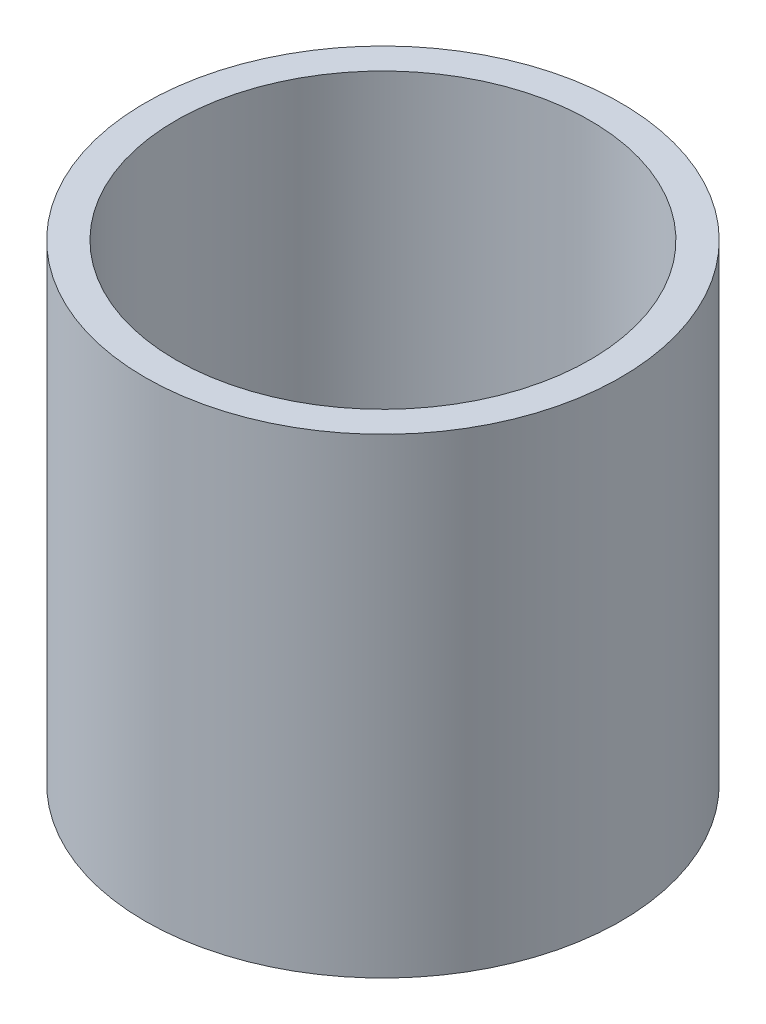
ISO-10303-21;
HEADER;
FILE_DESCRIPTION(('STEP AP214'),'2;1');
FILE_NAME('part.step','',(''),(''),'','','');
FILE_SCHEMA(('AUTOMOTIVE_DESIGN { 1 0 10303 214 1 1 1 1 }'));
ENDSEC;
DATA;
#1=APPLICATION_CONTEXT('core data for automotive mechanical design processes');
#2=APPLICATION_PROTOCOL_DEFINITION('international standard','automotive_design',2000,#1);
#3=PRODUCT_CONTEXT('',#1,'mechanical');
#4=PRODUCT('Part','Part','',(#3));
#5=PRODUCT_RELATED_PRODUCT_CATEGORY('part','',(#4));
#6=PRODUCT_DEFINITION_FORMATION('','',#4);
#7=PRODUCT_DEFINITION_CONTEXT('part definition',#1,'design');
#8=PRODUCT_DEFINITION('design','',#6,#7);
#9=PRODUCT_DEFINITION_SHAPE('','',#8);
#10=(LENGTH_UNIT() NAMED_UNIT(*) SI_UNIT(.MILLI.,.METRE.));
#11=(NAMED_UNIT(*) PLANE_ANGLE_UNIT() SI_UNIT($,.RADIAN.));
#12=(NAMED_UNIT(*) SI_UNIT($,.STERADIAN.) SOLID_ANGLE_UNIT());
#13=UNCERTAINTY_MEASURE_WITH_UNIT(LENGTH_MEASURE(1.E-05),#10,'distance_accuracy_value','');
#14=(GEOMETRIC_REPRESENTATION_CONTEXT(3) GLOBAL_UNCERTAINTY_ASSIGNED_CONTEXT((#13)) GLOBAL_UNIT_ASSIGNED_CONTEXT((#10,
#11,#12)) REPRESENTATION_CONTEXT('',''));
#15=CARTESIAN_POINT('',(0.,0.,0.));
#16=DIRECTION('',(0.,0.,1.));
#17=DIRECTION('',(1.,0.,0.));
#18=AXIS2_PLACEMENT_3D('',#15,#16,#17);
#19=CARTESIAN_POINT('',(0.,6.35,0.));
#20=DIRECTION('',(0.,1.,0.));
#21=DIRECTION('',(0.,0.,1.));
#22=AXIS2_PLACEMENT_3D('',#19,#20,#21);
#23=PLANE('',#22);
#24=CARTESIAN_POINT('',(0.,6.35,0.));
#25=DIRECTION('',(0.,1.,0.));
#26=DIRECTION('',(0.,0.,1.));
#27=AXIS2_PLACEMENT_3D('',#24,#25,#26);
#28=CIRCLE('',#27,6.4135);
#29=CARTESIAN_POINT('',(0.,6.35,6.4135));
#30=VERTEX_POINT('',#29);
#31=EDGE_CURVE('E10',#30,#30,#28,.T.);
#32=ORIENTED_EDGE('',*,*,#31,.T.);
#33=EDGE_LOOP('',(#32));
#34=FACE_BOUND('',#33,.T.);
#35=CARTESIAN_POINT('',(0.,6.35,0.));
#36=DIRECTION('',(0.,1.,0.));
#37=DIRECTION('',(0.,0.,1.));
#38=AXIS2_PLACEMENT_3D('',#35,#36,#37);
#39=CIRCLE('',#38,5.588);
#40=CARTESIAN_POINT('',(0.,6.35,5.588));
#41=VERTEX_POINT('',#40);
#42=EDGE_CURVE('E44',#41,#41,#39,.T.);
#43=ORIENTED_EDGE('',*,*,#42,.F.);
#44=EDGE_LOOP('',(#43));
#45=FACE_BOUND('',#44,.T.);
#46=ADVANCED_FACE('F33',(#34,#45),#23,.T.);
#47=CARTESIAN_POINT('',(0.,-6.35,0.));
#48=DIRECTION('',(0.,1.,0.));
#49=DIRECTION('',(0.,0.,1.));
#50=AXIS2_PLACEMENT_3D('',#47,#48,#49);
#51=PLANE('',#50);
#52=CARTESIAN_POINT('',(0.,-6.35,0.));
#53=DIRECTION('',(0.,1.,0.));
#54=DIRECTION('',(0.,0.,1.));
#55=AXIS2_PLACEMENT_3D('',#52,#53,#54);
#56=CIRCLE('',#55,6.4135);
#57=CARTESIAN_POINT('',(0.,-6.35,6.4135));
#58=VERTEX_POINT('',#57);
#59=EDGE_CURVE('E37',#58,#58,#56,.T.);
#60=ORIENTED_EDGE('',*,*,#59,.F.);
#61=EDGE_LOOP('',(#60));
#62=FACE_BOUND('',#61,.T.);
#63=CARTESIAN_POINT('',(0.,-6.35,0.));
#64=DIRECTION('',(0.,1.,0.));
#65=DIRECTION('',(0.,0.,1.));
#66=AXIS2_PLACEMENT_3D('',#63,#64,#65);
#67=CIRCLE('',#66,5.588);
#68=CARTESIAN_POINT('',(0.,-6.35,5.588));
#69=VERTEX_POINT('',#68);
#70=EDGE_CURVE('E46',#69,#69,#67,.T.);
#71=ORIENTED_EDGE('',*,*,#70,.T.);
#72=EDGE_LOOP('',(#71));
#73=FACE_BOUND('',#72,.T.);
#74=ADVANCED_FACE('F56',(#62,#73),#51,.F.);
#75=CARTESIAN_POINT('',(0.,6.35,0.));
#76=DIRECTION('',(0.,-1.,0.));
#77=DIRECTION('',(0.,0.,-1.));
#78=AXIS2_PLACEMENT_3D('',#75,#76,#77);
#79=CYLINDRICAL_SURFACE('',#78,6.4135);
#80=ORIENTED_EDGE('',*,*,#31,.F.);
#81=EDGE_LOOP('',(#80));
#82=FACE_BOUND('',#81,.T.);
#83=ORIENTED_EDGE('',*,*,#59,.T.);
#84=EDGE_LOOP('',(#83));
#85=FACE_BOUND('',#84,.T.);
#86=ADVANCED_FACE('F35',(#82,#85),#79,.T.);
#87=CARTESIAN_POINT('',(0.,6.35,0.));
#88=DIRECTION('',(0.,-1.,0.));
#89=DIRECTION('',(0.,0.,-1.));
#90=AXIS2_PLACEMENT_3D('',#87,#88,#89);
#91=CYLINDRICAL_SURFACE('',#90,5.588);
#92=ORIENTED_EDGE('',*,*,#42,.T.);
#93=EDGE_LOOP('',(#92));
#94=FACE_BOUND('',#93,.T.);
#95=ORIENTED_EDGE('',*,*,#70,.F.);
#96=EDGE_LOOP('',(#95));
#97=FACE_BOUND('',#96,.T.);
#98=ADVANCED_FACE('F52',(#94,#97),#91,.F.);
#99=CLOSED_SHELL('',(#46,#74,#86,#98));
#100=MANIFOLD_SOLID_BREP('B2',#99);
#101=ADVANCED_BREP_SHAPE_REPRESENTATION('',(#18,#100),#14);
#102=SHAPE_DEFINITION_REPRESENTATION(#9,#101);
ENDSEC;
END-ISO-10303-21;
